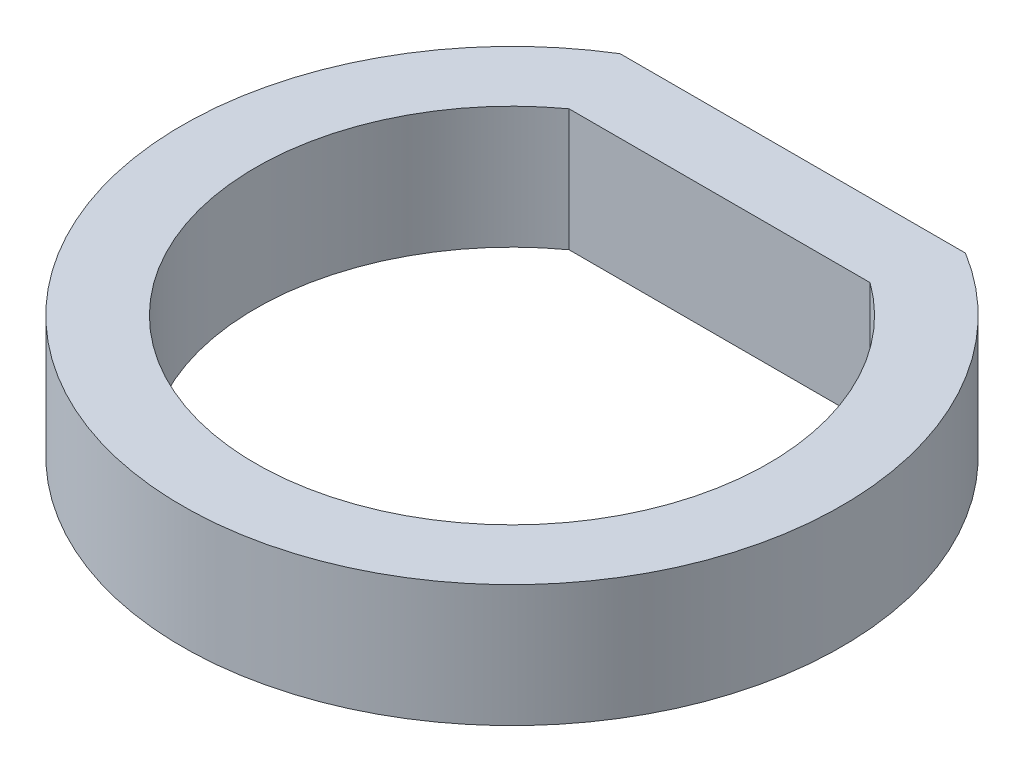
ISO-10303-21;
HEADER;
FILE_DESCRIPTION(('STEP AP214'),'2;1');
FILE_NAME('part.step','',(''),(''),'','','');
FILE_SCHEMA(('AUTOMOTIVE_DESIGN { 1 0 10303 214 1 1 1 1 }'));
ENDSEC;
DATA;
#1=APPLICATION_CONTEXT('core data for automotive mechanical design processes');
#2=APPLICATION_PROTOCOL_DEFINITION('international standard','automotive_design',2000,#1);
#3=PRODUCT_CONTEXT('',#1,'mechanical');
#4=PRODUCT('Part','Part','',(#3));
#5=PRODUCT_RELATED_PRODUCT_CATEGORY('part','',(#4));
#6=PRODUCT_DEFINITION_FORMATION('','',#4);
#7=PRODUCT_DEFINITION_CONTEXT('part definition',#1,'design');
#8=PRODUCT_DEFINITION('design','',#6,#7);
#9=PRODUCT_DEFINITION_SHAPE('','',#8);
#10=(LENGTH_UNIT() NAMED_UNIT(*) SI_UNIT(.MILLI.,.METRE.));
#11=(NAMED_UNIT(*) PLANE_ANGLE_UNIT() SI_UNIT($,.RADIAN.));
#12=(NAMED_UNIT(*) SI_UNIT($,.STERADIAN.) SOLID_ANGLE_UNIT());
#13=UNCERTAINTY_MEASURE_WITH_UNIT(LENGTH_MEASURE(1.E-05),#10,'distance_accuracy_value','');
#14=(GEOMETRIC_REPRESENTATION_CONTEXT(3) GLOBAL_UNCERTAINTY_ASSIGNED_CONTEXT((#13)) GLOBAL_UNIT_ASSIGNED_CONTEXT((#10,
#11,#12)) REPRESENTATION_CONTEXT('',''));
#15=CARTESIAN_POINT('',(0.,0.,0.));
#16=DIRECTION('',(0.,0.,1.));
#17=DIRECTION('',(1.,0.,0.));
#18=AXIS2_PLACEMENT_3D('',#15,#16,#17);
#19=CARTESIAN_POINT('',(0.,5.,-34.0643121875443));
#20=DIRECTION('',(0.,0.,-1.));
#21=DIRECTION('',(-1.,0.,0.));
#22=AXIS2_PLACEMENT_3D('',#19,#20,#21);
#23=PLANE('',#22);
#24=DIRECTION('',(1.,0.,0.));
#25=VECTOR('',#24,1.);
#26=CARTESIAN_POINT('',(0.,0.,-34.0643121875443));
#27=LINE('',#26,#25);
#28=CARTESIAN_POINT('',(-19.7514633328549,0.,-34.0643121875443));
#29=VERTEX_POINT('',#28);
#30=CARTESIAN_POINT('',(-5.60932770912394,0.,-34.0643121875443));
#31=VERTEX_POINT('',#30);
#32=EDGE_CURVE('E102',#29,#31,#27,.T.);
#33=ORIENTED_EDGE('',*,*,#32,.F.);
#34=DIRECTION('',(0.,-1.,0.));
#35=VECTOR('',#34,1.);
#36=CARTESIAN_POINT('',(-19.7514633328549,5.,-34.0643121875443));
#37=LINE('',#36,#35);
#38=CARTESIAN_POINT('',(-19.7514633328549,5.,-34.0643121875443));
#39=VERTEX_POINT('',#38);
#40=EDGE_CURVE('E11',#39,#29,#37,.T.);
#41=ORIENTED_EDGE('',*,*,#40,.F.);
#42=DIRECTION('',(1.,0.,0.));
#43=VECTOR('',#42,1.);
#44=CARTESIAN_POINT('',(0.,5.,-34.0643121875443));
#45=LINE('',#44,#43);
#46=CARTESIAN_POINT('',(-5.60932770912394,5.,-34.0643121875443));
#47=VERTEX_POINT('',#46);
#48=EDGE_CURVE('E94',#39,#47,#45,.T.);
#49=ORIENTED_EDGE('',*,*,#48,.T.);
#50=DIRECTION('',(0.,-1.,0.));
#51=VECTOR('',#50,1.);
#52=CARTESIAN_POINT('',(-5.60932770912394,5.,-34.0643121875443));
#53=LINE('',#52,#51);
#54=EDGE_CURVE('E43',#47,#31,#53,.T.);
#55=ORIENTED_EDGE('',*,*,#54,.T.);
#56=EDGE_LOOP('',(#33,#41,#49,#55));
#57=FACE_BOUND('',#56,.T.);
#58=ADVANCED_FACE('F33',(#57),#23,.T.);
#59=CARTESIAN_POINT('',(0.,5.,-31.0643121875443));
#60=DIRECTION('',(0.,0.,-1.));
#61=DIRECTION('',(-1.,0.,0.));
#62=AXIS2_PLACEMENT_3D('',#59,#60,#61);
#63=PLANE('',#62);
#64=DIRECTION('',(1.,0.,0.));
#65=VECTOR('',#64,1.);
#66=CARTESIAN_POINT('',(0.,0.,-31.0643121875443));
#67=LINE('',#66,#65);
#68=CARTESIAN_POINT('',(-18.8448095239584,0.,-31.0643121875443));
#69=VERTEX_POINT('',#68);
#70=CARTESIAN_POINT('',(-6.51598151802043,0.,-31.0643121875443));
#71=VERTEX_POINT('',#70);
#72=EDGE_CURVE('E99',#69,#71,#67,.T.);
#73=ORIENTED_EDGE('',*,*,#72,.T.);
#74=DIRECTION('',(0.,-1.,0.));
#75=VECTOR('',#74,1.);
#76=CARTESIAN_POINT('',(-6.51598151802043,5.,-31.0643121875443));
#77=LINE('',#76,#75);
#78=CARTESIAN_POINT('',(-6.51598151802043,5.,-31.0643121875443));
#79=VERTEX_POINT('',#78);
#80=EDGE_CURVE('E37',#79,#71,#77,.T.);
#81=ORIENTED_EDGE('',*,*,#80,.F.);
#82=DIRECTION('',(1.,0.,0.));
#83=VECTOR('',#82,1.);
#84=CARTESIAN_POINT('',(0.,5.,-31.0643121875443));
#85=LINE('',#84,#83);
#86=CARTESIAN_POINT('',(-18.8448095239584,5.,-31.0643121875443));
#87=VERTEX_POINT('',#86);
#88=EDGE_CURVE('E77',#87,#79,#85,.T.);
#89=ORIENTED_EDGE('',*,*,#88,.F.);
#90=DIRECTION('',(0.,-1.,0.));
#91=VECTOR('',#90,1.);
#92=CARTESIAN_POINT('',(-18.8448095239584,5.,-31.0643121875443));
#93=LINE('',#92,#91);
#94=EDGE_CURVE('E83',#87,#69,#93,.T.);
#95=ORIENTED_EDGE('',*,*,#94,.T.);
#96=EDGE_LOOP('',(#73,#81,#89,#95));
#97=FACE_BOUND('',#96,.T.);
#98=ADVANCED_FACE('F35',(#97),#63,.F.);
#99=CARTESIAN_POINT('',(-12.6803955209894,5.,-22.5643121875443));
#100=DIRECTION('',(0.,-1.,0.));
#101=DIRECTION('',(0.,0.,-1.));
#102=AXIS2_PLACEMENT_3D('',#99,#100,#101);
#103=CYLINDRICAL_SURFACE('',#102,10.5);
#104=CARTESIAN_POINT('',(-12.6803955209894,0.,-22.5643121875443));
#105=DIRECTION('',(0.,1.,0.));
#106=DIRECTION('',(0.,0.,1.));
#107=AXIS2_PLACEMENT_3D('',#104,#105,#106);
#108=CIRCLE('',#107,10.5);
#109=EDGE_CURVE('E87',#69,#71,#108,.T.);
#110=ORIENTED_EDGE('',*,*,#109,.F.);
#111=ORIENTED_EDGE('',*,*,#94,.F.);
#112=CARTESIAN_POINT('',(-12.6803955209894,5.,-22.5643121875443));
#113=DIRECTION('',(0.,1.,0.));
#114=DIRECTION('',(0.,0.,1.));
#115=AXIS2_PLACEMENT_3D('',#112,#113,#114);
#116=CIRCLE('',#115,10.5);
#117=EDGE_CURVE('E85',#87,#79,#116,.T.);
#118=ORIENTED_EDGE('',*,*,#117,.T.);
#119=ORIENTED_EDGE('',*,*,#80,.T.);
#120=EDGE_LOOP('',(#110,#111,#118,#119));
#121=FACE_BOUND('',#120,.T.);
#122=ADVANCED_FACE('F84',(#121),#103,.F.);
#123=CARTESIAN_POINT('',(-12.6803955209894,5.,-22.5643121875443));
#124=DIRECTION('',(0.,-1.,0.));
#125=DIRECTION('',(0.,0.,-1.));
#126=AXIS2_PLACEMENT_3D('',#123,#124,#125);
#127=CYLINDRICAL_SURFACE('',#126,13.5);
#128=CARTESIAN_POINT('',(-12.6803955209894,0.,-22.5643121875443));
#129=DIRECTION('',(0.,1.,0.));
#130=DIRECTION('',(0.,0.,1.));
#131=AXIS2_PLACEMENT_3D('',#128,#129,#130);
#132=CIRCLE('',#131,13.5);
#133=EDGE_CURVE('E91',#29,#31,#132,.T.);
#134=ORIENTED_EDGE('',*,*,#133,.T.);
#135=ORIENTED_EDGE('',*,*,#54,.F.);
#136=CARTESIAN_POINT('',(-12.6803955209894,5.,-22.5643121875443));
#137=DIRECTION('',(0.,1.,0.));
#138=DIRECTION('',(0.,0.,1.));
#139=AXIS2_PLACEMENT_3D('',#136,#137,#138);
#140=CIRCLE('',#139,13.5);
#141=EDGE_CURVE('E51',#39,#47,#140,.T.);
#142=ORIENTED_EDGE('',*,*,#141,.F.);
#143=ORIENTED_EDGE('',*,*,#40,.T.);
#144=EDGE_LOOP('',(#134,#135,#142,#143));
#145=FACE_BOUND('',#144,.T.);
#146=ADVANCED_FACE('F111',(#145),#127,.T.);
#147=CARTESIAN_POINT('',(0.,5.,0.));
#148=DIRECTION('',(0.,1.,0.));
#149=DIRECTION('',(0.,0.,1.));
#150=AXIS2_PLACEMENT_3D('',#147,#148,#149);
#151=PLANE('',#150);
#152=ORIENTED_EDGE('',*,*,#88,.T.);
#153=ORIENTED_EDGE('',*,*,#117,.F.);
#154=EDGE_LOOP('',(#152,#153));
#155=FACE_BOUND('',#154,.T.);
#156=ORIENTED_EDGE('',*,*,#48,.F.);
#157=ORIENTED_EDGE('',*,*,#141,.T.);
#158=EDGE_LOOP('',(#156,#157));
#159=FACE_BOUND('',#158,.T.);
#160=ADVANCED_FACE('F93',(#155,#159),#151,.T.);
#161=CARTESIAN_POINT('',(0.,0.,0.));
#162=DIRECTION('',(0.,1.,0.));
#163=DIRECTION('',(0.,0.,1.));
#164=AXIS2_PLACEMENT_3D('',#161,#162,#163);
#165=PLANE('',#164);
#166=ORIENTED_EDGE('',*,*,#72,.F.);
#167=ORIENTED_EDGE('',*,*,#109,.T.);
#168=EDGE_LOOP('',(#166,#167));
#169=FACE_BOUND('',#168,.T.);
#170=ORIENTED_EDGE('',*,*,#32,.T.);
#171=ORIENTED_EDGE('',*,*,#133,.F.);
#172=EDGE_LOOP('',(#170,#171));
#173=FACE_BOUND('',#172,.T.);
#174=ADVANCED_FACE('F107',(#169,#173),#165,.F.);
#175=CLOSED_SHELL('',(#58,#98,#122,#146,#160,#174));
#176=MANIFOLD_SOLID_BREP('B2',#175);
#177=ADVANCED_BREP_SHAPE_REPRESENTATION('',(#18,#176),#14);
#178=SHAPE_DEFINITION_REPRESENTATION(#9,#177);
ENDSEC;
END-ISO-10303-21;
